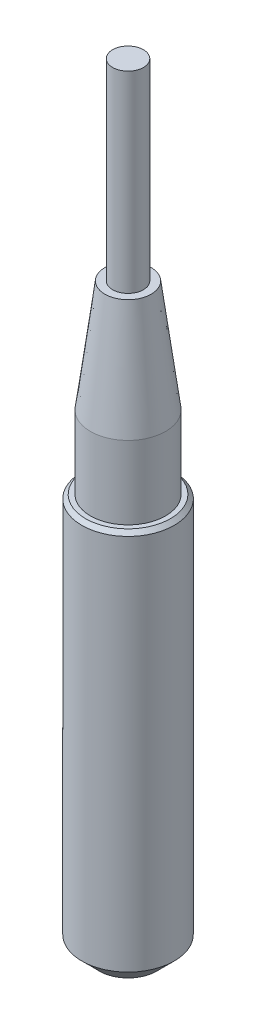
ISO-10303-21;
HEADER;
FILE_DESCRIPTION(('STEP AP214'),'2;1');
FILE_NAME('part.step','',(''),(''),'','','');
FILE_SCHEMA(('AUTOMOTIVE_DESIGN { 1 0 10303 214 1 1 1 1 }'));
ENDSEC;
DATA;
#1=APPLICATION_CONTEXT('core data for automotive mechanical design processes');
#2=APPLICATION_PROTOCOL_DEFINITION('international standard','automotive_design',2000,#1);
#3=PRODUCT_CONTEXT('',#1,'mechanical');
#4=PRODUCT('Part','Part','',(#3));
#5=PRODUCT_RELATED_PRODUCT_CATEGORY('part','',(#4));
#6=PRODUCT_DEFINITION_FORMATION('','',#4);
#7=PRODUCT_DEFINITION_CONTEXT('part definition',#1,'design');
#8=PRODUCT_DEFINITION('design','',#6,#7);
#9=PRODUCT_DEFINITION_SHAPE('','',#8);
#10=(LENGTH_UNIT() NAMED_UNIT(*) SI_UNIT(.MILLI.,.METRE.));
#11=(NAMED_UNIT(*) PLANE_ANGLE_UNIT() SI_UNIT($,.RADIAN.));
#12=(NAMED_UNIT(*) SI_UNIT($,.STERADIAN.) SOLID_ANGLE_UNIT());
#13=UNCERTAINTY_MEASURE_WITH_UNIT(LENGTH_MEASURE(1.E-05),#10,'distance_accuracy_value','');
#14=(GEOMETRIC_REPRESENTATION_CONTEXT(3) GLOBAL_UNCERTAINTY_ASSIGNED_CONTEXT((#13)) GLOBAL_UNIT_ASSIGNED_CONTEXT((#10,
#11,#12)) REPRESENTATION_CONTEXT('',''));
#15=CARTESIAN_POINT('',(0.,0.,0.));
#16=DIRECTION('',(0.,0.,1.));
#17=DIRECTION('',(1.,0.,0.));
#18=AXIS2_PLACEMENT_3D('',#15,#16,#17);
#19=CARTESIAN_POINT('',(0.,87.8876568097585,0.));
#20=DIRECTION('',(0.,1.,0.));
#21=DIRECTION('',(0.,0.,1.));
#22=AXIS2_PLACEMENT_3D('',#19,#20,#21);
#23=PLANE('',#22);
#24=CARTESIAN_POINT('',(0.,87.8876568097585,0.));
#25=DIRECTION('',(0.,1.,0.));
#26=DIRECTION('',(0.,0.,1.));
#27=AXIS2_PLACEMENT_3D('',#24,#25,#26);
#28=CIRCLE('',#27,9.75);
#29=CARTESIAN_POINT('',(0.,87.8876568097585,9.75));
#30=VERTEX_POINT('',#29);
#31=EDGE_CURVE('E10',#30,#30,#28,.T.);
#32=ORIENTED_EDGE('',*,*,#31,.F.);
#33=EDGE_LOOP('',(#32));
#34=FACE_BOUND('',#33,.T.);
#35=CARTESIAN_POINT('',(0.,87.8876568097585,0.));
#36=DIRECTION('',(0.,1.,0.));
#37=DIRECTION('',(0.,0.,1.));
#38=AXIS2_PLACEMENT_3D('',#35,#36,#37);
#39=CIRCLE('',#38,11.);
#40=CARTESIAN_POINT('',(0.,87.8876568097585,11.));
#41=VERTEX_POINT('',#40);
#42=EDGE_CURVE('E58',#41,#41,#39,.T.);
#43=ORIENTED_EDGE('',*,*,#42,.T.);
#44=EDGE_LOOP('',(#43));
#45=FACE_BOUND('',#44,.T.);
#46=ADVANCED_FACE('F53',(#34,#45),#23,.T.);
#47=CARTESIAN_POINT('',(0.,-15.6123431902415,0.));
#48=DIRECTION('',(0.,-1.,0.));
#49=DIRECTION('',(0.,0.,-1.));
#50=AXIS2_PLACEMENT_3D('',#47,#48,#49);
#51=PLANE('',#50);
#52=CARTESIAN_POINT('',(0.,-15.6123431902415,0.));
#53=DIRECTION('',(0.,-1.,0.));
#54=DIRECTION('',(0.,0.,-1.));
#55=AXIS2_PLACEMENT_3D('',#52,#53,#54);
#56=CIRCLE('',#55,7.5);
#57=CARTESIAN_POINT('',(0.,-15.6123431902415,-7.5));
#58=VERTEX_POINT('',#57);
#59=EDGE_CURVE('E81',#58,#58,#56,.T.);
#60=ORIENTED_EDGE('',*,*,#59,.T.);
#61=EDGE_LOOP('',(#60));
#62=FACE_BOUND('',#61,.T.);
#63=ADVANCED_FACE('F105',(#62),#51,.T.);
#64=CARTESIAN_POINT('',(0.,-15.6123431902415,0.));
#65=DIRECTION('',(0.,1.,0.));
#66=DIRECTION('',(0.,0.,1.));
#67=AXIS2_PLACEMENT_3D('',#64,#65,#66);
#68=CONICAL_SURFACE('',#67,7.5,0.78539816339745);
#69=CARTESIAN_POINT('',(0.,-11.1123431902415,0.));
#70=DIRECTION('',(0.,-1.,0.));
#71=DIRECTION('',(0.,0.,-1.));
#72=AXIS2_PLACEMENT_3D('',#69,#70,#71);
#73=CIRCLE('',#72,12.);
#74=CARTESIAN_POINT('',(0.,-11.1123431902415,-12.));
#75=VERTEX_POINT('',#74);
#76=EDGE_CURVE('E77',#75,#75,#73,.T.);
#77=ORIENTED_EDGE('',*,*,#76,.T.);
#78=EDGE_LOOP('',(#77));
#79=FACE_BOUND('',#78,.T.);
#80=ORIENTED_EDGE('',*,*,#59,.F.);
#81=EDGE_LOOP('',(#80));
#82=FACE_BOUND('',#81,.T.);
#83=ADVANCED_FACE('F102',(#79,#82),#68,.T.);
#84=CARTESIAN_POINT('',(0.,0.,0.));
#85=DIRECTION('',(0.,-1.,0.));
#86=DIRECTION('',(0.,0.,-1.));
#87=AXIS2_PLACEMENT_3D('',#84,#85,#86);
#88=CYLINDRICAL_SURFACE('',#87,12.);
#89=CARTESIAN_POINT('',(0.,86.8876568097585,0.));
#90=DIRECTION('',(0.,1.,0.));
#91=DIRECTION('',(0.,0.,1.));
#92=AXIS2_PLACEMENT_3D('',#89,#90,#91);
#93=CIRCLE('',#92,12.);
#94=CARTESIAN_POINT('',(0.,86.8876568097585,12.));
#95=VERTEX_POINT('',#94);
#96=EDGE_CURVE('E68',#95,#95,#93,.F.);
#97=ORIENTED_EDGE('',*,*,#96,.T.);
#98=EDGE_LOOP('',(#97));
#99=FACE_BOUND('',#98,.T.);
#100=ORIENTED_EDGE('',*,*,#76,.F.);
#101=EDGE_LOOP('',(#100));
#102=FACE_BOUND('',#101,.T.);
#103=ADVANCED_FACE('F88',(#99,#102),#88,.T.);
#104=CARTESIAN_POINT('',(0.,86.8876568097585,0.));
#105=DIRECTION('',(0.,-1.,0.));
#106=DIRECTION('',(0.,0.,-1.));
#107=AXIS2_PLACEMENT_3D('',#104,#105,#106);
#108=CONICAL_SURFACE('',#107,12.,0.785398163397439);
#109=ORIENTED_EDGE('',*,*,#42,.F.);
#110=EDGE_LOOP('',(#109));
#111=FACE_BOUND('',#110,.T.);
#112=ORIENTED_EDGE('',*,*,#96,.F.);
#113=EDGE_LOOP('',(#112));
#114=FACE_BOUND('',#113,.T.);
#115=ADVANCED_FACE('F56',(#111,#114),#108,.T.);
#116=CARTESIAN_POINT('',(0.,135.887656809759,0.));
#117=DIRECTION('',(0.,1.,0.));
#118=DIRECTION('',(0.,0.,1.));
#119=AXIS2_PLACEMENT_3D('',#116,#117,#118);
#120=CYLINDRICAL_SURFACE('',#119,4.);
#121=CARTESIAN_POINT('',(0.,185.887656809758,0.));
#122=DIRECTION('',(0.,1.,0.));
#123=DIRECTION('',(0.,0.,1.));
#124=AXIS2_PLACEMENT_3D('',#121,#122,#123);
#125=CIRCLE('',#124,4.);
#126=CARTESIAN_POINT('',(0.,185.887656809758,4.));
#127=VERTEX_POINT('',#126);
#128=EDGE_CURVE('E73',#127,#127,#125,.T.);
#129=ORIENTED_EDGE('',*,*,#128,.F.);
#130=EDGE_LOOP('',(#129));
#131=FACE_BOUND('',#130,.T.);
#132=CARTESIAN_POINT('',(0.,135.887656809759,0.));
#133=DIRECTION('',(0.,1.,0.));
#134=DIRECTION('',(0.,0.,1.));
#135=AXIS2_PLACEMENT_3D('',#132,#133,#134);
#136=CIRCLE('',#135,4.);
#137=CARTESIAN_POINT('',(0.,135.887656809759,4.));
#138=VERTEX_POINT('',#137);
#139=EDGE_CURVE('E140',#138,#138,#136,.T.);
#140=ORIENTED_EDGE('',*,*,#139,.T.);
#141=EDGE_LOOP('',(#140));
#142=FACE_BOUND('',#141,.T.);
#143=ADVANCED_FACE('F92',(#131,#142),#120,.T.);
#144=CARTESIAN_POINT('',(4.,185.887656809758,0.));
#145=DIRECTION('',(0.,-1.,0.));
#146=DIRECTION('',(0.,0.,-1.));
#147=AXIS2_PLACEMENT_3D('',#144,#145,#146);
#148=PLANE('',#147);
#149=ORIENTED_EDGE('',*,*,#128,.T.);
#150=EDGE_LOOP('',(#149));
#151=FACE_BOUND('',#150,.T.);
#152=ADVANCED_FACE('F99',(#151),#148,.F.);
#153=CARTESIAN_POINT('',(0.,135.887656809759,0.));
#154=DIRECTION('',(0.,1.,0.));
#155=DIRECTION('',(0.,0.,1.));
#156=AXIS2_PLACEMENT_3D('',#153,#154,#155);
#157=CYLINDRICAL_SURFACE('',#156,9.75);
#158=CARTESIAN_POINT('',(0.,106.887656809758,0.));
#159=DIRECTION('',(0.,1.,0.));
#160=DIRECTION('',(0.,0.,1.));
#161=AXIS2_PLACEMENT_3D('',#158,#159,#160);
#162=CIRCLE('',#161,9.75);
#163=CARTESIAN_POINT('',(0.,106.887656809758,9.75));
#164=VERTEX_POINT('',#163);
#165=EDGE_CURVE('E71',#164,#164,#162,.T.);
#166=ORIENTED_EDGE('',*,*,#165,.F.);
#167=EDGE_LOOP('',(#166));
#168=FACE_BOUND('',#167,.T.);
#169=ORIENTED_EDGE('',*,*,#31,.T.);
#170=EDGE_LOOP('',(#169));
#171=FACE_BOUND('',#170,.T.);
#172=ADVANCED_FACE('F120',(#168,#171),#157,.T.);
#173=CARTESIAN_POINT('',(0.,135.887656809759,0.));
#174=DIRECTION('',(0.,-1.,0.));
#175=DIRECTION('',(0.,0.,-1.));
#176=AXIS2_PLACEMENT_3D('',#173,#174,#175);
#177=CONICAL_SURFACE('',#176,6.,0.128596750654903);
#178=ORIENTED_EDGE('',*,*,#165,.T.);
#179=EDGE_LOOP('',(#178));
#180=FACE_BOUND('',#179,.T.);
#181=CARTESIAN_POINT('',(0.,135.887656809759,0.));
#182=DIRECTION('',(0.,1.,0.));
#183=DIRECTION('',(0.,0.,1.));
#184=AXIS2_PLACEMENT_3D('',#181,#182,#183);
#185=CIRCLE('',#184,6.);
#186=CARTESIAN_POINT('',(0.,135.887656809759,6.));
#187=VERTEX_POINT('',#186);
#188=EDGE_CURVE('E137',#187,#187,#185,.T.);
#189=ORIENTED_EDGE('',*,*,#188,.F.);
#190=EDGE_LOOP('',(#189));
#191=FACE_BOUND('',#190,.T.);
#192=ADVANCED_FACE('F124',(#180,#191),#177,.T.);
#193=CARTESIAN_POINT('',(4.,135.887656809759,0.));
#194=DIRECTION('',(0.,1.,0.));
#195=DIRECTION('',(0.,0.,1.));
#196=AXIS2_PLACEMENT_3D('',#193,#194,#195);
#197=PLANE('',#196);
#198=ORIENTED_EDGE('',*,*,#188,.T.);
#199=EDGE_LOOP('',(#198));
#200=FACE_BOUND('',#199,.T.);
#201=ORIENTED_EDGE('',*,*,#139,.F.);
#202=EDGE_LOOP('',(#201));
#203=FACE_BOUND('',#202,.T.);
#204=ADVANCED_FACE('F128',(#200,#203),#197,.T.);
#205=CLOSED_SHELL('',(#46,#63,#83,#103,#115,#143,#152,#172,#192,#204));
#206=MANIFOLD_SOLID_BREP('B2',#205);
#207=ADVANCED_BREP_SHAPE_REPRESENTATION('',(#18,#206),#14);
#208=SHAPE_DEFINITION_REPRESENTATION(#9,#207);
ENDSEC;
END-ISO-10303-21;
